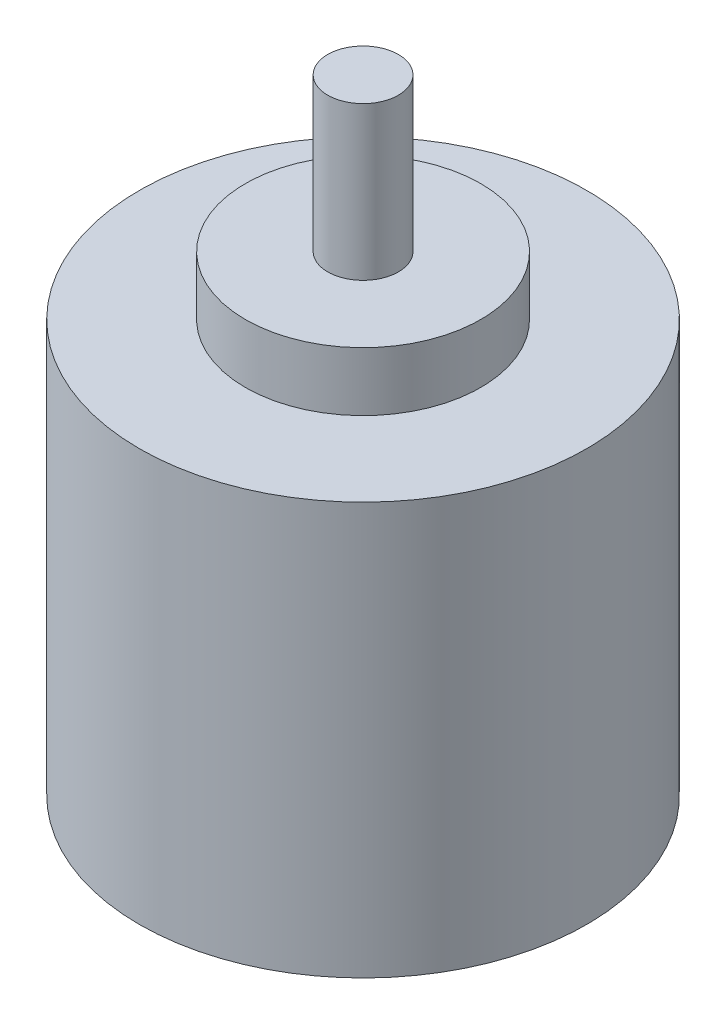
ISO-10303-21;
HEADER;
FILE_DESCRIPTION(('STEP AP214'),'2;1');
FILE_NAME('part.step','',(''),(''),'','','');
FILE_SCHEMA(('AUTOMOTIVE_DESIGN { 1 0 10303 214 1 1 1 1 }'));
ENDSEC;
DATA;
#1=APPLICATION_CONTEXT('core data for automotive mechanical design processes');
#2=APPLICATION_PROTOCOL_DEFINITION('international standard','automotive_design',2000,#1);
#3=PRODUCT_CONTEXT('',#1,'mechanical');
#4=PRODUCT('Part','Part','',(#3));
#5=PRODUCT_RELATED_PRODUCT_CATEGORY('part','',(#4));
#6=PRODUCT_DEFINITION_FORMATION('','',#4);
#7=PRODUCT_DEFINITION_CONTEXT('part definition',#1,'design');
#8=PRODUCT_DEFINITION('design','',#6,#7);
#9=PRODUCT_DEFINITION_SHAPE('','',#8);
#10=(LENGTH_UNIT() NAMED_UNIT(*) SI_UNIT(.MILLI.,.METRE.));
#11=(NAMED_UNIT(*) PLANE_ANGLE_UNIT() SI_UNIT($,.RADIAN.));
#12=(NAMED_UNIT(*) SI_UNIT($,.STERADIAN.) SOLID_ANGLE_UNIT());
#13=UNCERTAINTY_MEASURE_WITH_UNIT(LENGTH_MEASURE(1.E-05),#10,'distance_accuracy_value','');
#14=(GEOMETRIC_REPRESENTATION_CONTEXT(3) GLOBAL_UNCERTAINTY_ASSIGNED_CONTEXT((#13)) GLOBAL_UNIT_ASSIGNED_CONTEXT((#10,
#11,#12)) REPRESENTATION_CONTEXT('',''));
#15=CARTESIAN_POINT('',(0.,0.,0.));
#16=DIRECTION('',(0.,0.,1.));
#17=DIRECTION('',(1.,0.,0.));
#18=AXIS2_PLACEMENT_3D('',#15,#16,#17);
#19=CARTESIAN_POINT('',(0.,35.,0.));
#20=DIRECTION('',(0.,-1.,0.));
#21=DIRECTION('',(0.,0.,-1.));
#22=AXIS2_PLACEMENT_3D('',#19,#20,#21);
#23=CYLINDRICAL_SURFACE('',#22,19.);
#24=CARTESIAN_POINT('',(0.,35.,0.));
#25=DIRECTION('',(0.,1.,0.));
#26=DIRECTION('',(0.,0.,1.));
#27=AXIS2_PLACEMENT_3D('',#24,#25,#26);
#28=CIRCLE('',#27,19.);
#29=CARTESIAN_POINT('',(0.,35.,19.));
#30=VERTEX_POINT('',#29);
#31=EDGE_CURVE('E51',#30,#30,#28,.T.);
#32=ORIENTED_EDGE('',*,*,#31,.F.);
#33=EDGE_LOOP('',(#32));
#34=FACE_BOUND('',#33,.T.);
#35=CARTESIAN_POINT('',(0.,0.,0.));
#36=DIRECTION('',(0.,1.,0.));
#37=DIRECTION('',(0.,0.,1.));
#38=AXIS2_PLACEMENT_3D('',#35,#36,#37);
#39=CIRCLE('',#38,19.);
#40=CARTESIAN_POINT('',(0.,0.,19.));
#41=VERTEX_POINT('',#40);
#42=EDGE_CURVE('E40',#41,#41,#39,.T.);
#43=ORIENTED_EDGE('',*,*,#42,.T.);
#44=EDGE_LOOP('',(#43));
#45=FACE_BOUND('',#44,.T.);
#46=ADVANCED_FACE('F37',(#34,#45),#23,.T.);
#47=CARTESIAN_POINT('',(0.,35.,0.));
#48=DIRECTION('',(0.,1.,0.));
#49=DIRECTION('',(0.,0.,1.));
#50=AXIS2_PLACEMENT_3D('',#47,#48,#49);
#51=PLANE('',#50);
#52=CARTESIAN_POINT('',(0.,35.,0.));
#53=DIRECTION('',(0.,1.,0.));
#54=DIRECTION('',(0.,0.,1.));
#55=AXIS2_PLACEMENT_3D('',#52,#53,#54);
#56=CIRCLE('',#55,10.);
#57=CARTESIAN_POINT('',(0.,35.,10.));
#58=VERTEX_POINT('',#57);
#59=EDGE_CURVE('E45',#58,#58,#56,.T.);
#60=ORIENTED_EDGE('',*,*,#59,.F.);
#61=EDGE_LOOP('',(#60));
#62=FACE_BOUND('',#61,.T.);
#63=ORIENTED_EDGE('',*,*,#31,.T.);
#64=EDGE_LOOP('',(#63));
#65=FACE_BOUND('',#64,.T.);
#66=ADVANCED_FACE('F71',(#62,#65),#51,.T.);
#67=CARTESIAN_POINT('',(0.,0.,0.));
#68=DIRECTION('',(0.,1.,0.));
#69=DIRECTION('',(0.,0.,1.));
#70=AXIS2_PLACEMENT_3D('',#67,#68,#69);
#71=PLANE('',#70);
#72=ORIENTED_EDGE('',*,*,#42,.F.);
#73=EDGE_LOOP('',(#72));
#74=FACE_BOUND('',#73,.T.);
#75=ADVANCED_FACE('F68',(#74),#71,.F.);
#76=CARTESIAN_POINT('',(0.,40.,0.));
#77=DIRECTION('',(0.,-1.,0.));
#78=DIRECTION('',(0.,0.,-1.));
#79=AXIS2_PLACEMENT_3D('',#76,#77,#78);
#80=CYLINDRICAL_SURFACE('',#79,10.);
#81=CARTESIAN_POINT('',(0.,40.,0.));
#82=DIRECTION('',(0.,1.,0.));
#83=DIRECTION('',(0.,0.,1.));
#84=AXIS2_PLACEMENT_3D('',#81,#82,#83);
#85=CIRCLE('',#84,10.);
#86=CARTESIAN_POINT('',(0.,40.,10.));
#87=VERTEX_POINT('',#86);
#88=EDGE_CURVE('E56',#87,#87,#85,.T.);
#89=ORIENTED_EDGE('',*,*,#88,.F.);
#90=EDGE_LOOP('',(#89));
#91=FACE_BOUND('',#90,.T.);
#92=ORIENTED_EDGE('',*,*,#59,.T.);
#93=EDGE_LOOP('',(#92));
#94=FACE_BOUND('',#93,.T.);
#95=ADVANCED_FACE('F70',(#91,#94),#80,.T.);
#96=CARTESIAN_POINT('',(0.,40.,0.));
#97=DIRECTION('',(0.,1.,0.));
#98=DIRECTION('',(0.,0.,1.));
#99=AXIS2_PLACEMENT_3D('',#96,#97,#98);
#100=PLANE('',#99);
#101=CARTESIAN_POINT('',(0.,40.,0.));
#102=DIRECTION('',(0.,1.,0.));
#103=DIRECTION('',(0.,0.,1.));
#104=AXIS2_PLACEMENT_3D('',#101,#102,#103);
#105=CIRCLE('',#104,3.);
#106=CARTESIAN_POINT('',(0.,40.,-3.));
#107=VERTEX_POINT('',#106);
#108=EDGE_CURVE('E10',#107,#107,#105,.T.);
#109=ORIENTED_EDGE('',*,*,#108,.F.);
#110=EDGE_LOOP('',(#109));
#111=FACE_BOUND('',#110,.T.);
#112=ORIENTED_EDGE('',*,*,#88,.T.);
#113=EDGE_LOOP('',(#112));
#114=FACE_BOUND('',#113,.T.);
#115=ADVANCED_FACE('F76',(#111,#114),#100,.T.);
#116=CARTESIAN_POINT('',(0.,53.,0.));
#117=DIRECTION('',(0.,-1.,0.));
#118=DIRECTION('',(0.,0.,-1.));
#119=AXIS2_PLACEMENT_3D('',#116,#117,#118);
#120=CYLINDRICAL_SURFACE('',#119,3.);
#121=CARTESIAN_POINT('',(0.,53.,0.));
#122=DIRECTION('',(0.,1.,0.));
#123=DIRECTION('',(0.,0.,1.));
#124=AXIS2_PLACEMENT_3D('',#121,#122,#123);
#125=CIRCLE('',#124,3.);
#126=CARTESIAN_POINT('',(0.,53.,-3.));
#127=VERTEX_POINT('',#126);
#128=EDGE_CURVE('E55',#127,#127,#125,.T.);
#129=CARTESIAN_POINT('',(0.,53.,-3.));
#130=CARTESIAN_POINT('',(0.,52.8645833333333,-3.));
#131=CARTESIAN_POINT('',(0.,52.7291666666667,-3.));
#132=CARTESIAN_POINT('',(0.,52.4583333333333,-3.));
#133=CARTESIAN_POINT('',(0.,52.3229166666667,-3.));
#134=CARTESIAN_POINT('',(0.,52.0520833333333,-3.));
#135=CARTESIAN_POINT('',(0.,51.9166666666667,-3.));
#136=CARTESIAN_POINT('',(0.,51.6458333333333,-3.));
#137=CARTESIAN_POINT('',(0.,51.5104166666667,-3.));
#138=CARTESIAN_POINT('',(0.,51.2395833333333,-3.));
#139=CARTESIAN_POINT('',(0.,51.1041666666667,-3.));
#140=CARTESIAN_POINT('',(0.,50.8333333333333,-3.));
#141=CARTESIAN_POINT('',(0.,50.6979166666667,-3.));
#142=CARTESIAN_POINT('',(0.,50.4270833333333,-3.));
#143=CARTESIAN_POINT('',(0.,50.2916666666667,-3.));
#144=CARTESIAN_POINT('',(0.,50.0208333333333,-3.));
#145=CARTESIAN_POINT('',(0.,49.8854166666667,-3.));
#146=CARTESIAN_POINT('',(0.,49.6145833333333,-3.));
#147=CARTESIAN_POINT('',(0.,49.4791666666667,-3.));
#148=CARTESIAN_POINT('',(0.,49.2083333333333,-3.));
#149=CARTESIAN_POINT('',(0.,49.0729166666667,-3.));
#150=CARTESIAN_POINT('',(0.,48.8020833333333,-3.));
#151=CARTESIAN_POINT('',(0.,48.6666666666667,-3.));
#152=CARTESIAN_POINT('',(0.,48.3958333333333,-3.));
#153=CARTESIAN_POINT('',(0.,48.2604166666667,-3.));
#154=CARTESIAN_POINT('',(0.,47.9895833333333,-3.));
#155=CARTESIAN_POINT('',(0.,47.8541666666667,-3.));
#156=CARTESIAN_POINT('',(0.,47.5833333333333,-3.));
#157=CARTESIAN_POINT('',(0.,47.4479166666667,-3.));
#158=CARTESIAN_POINT('',(0.,47.1770833333333,-3.));
#159=CARTESIAN_POINT('',(0.,47.0416666666667,-3.));
#160=CARTESIAN_POINT('',(0.,46.7708333333333,-3.));
#161=CARTESIAN_POINT('',(0.,46.6354166666667,-3.));
#162=CARTESIAN_POINT('',(0.,46.3645833333333,-3.));
#163=CARTESIAN_POINT('',(0.,46.2291666666667,-3.));
#164=CARTESIAN_POINT('',(0.,45.9583333333333,-3.));
#165=CARTESIAN_POINT('',(0.,45.8229166666667,-3.));
#166=CARTESIAN_POINT('',(0.,45.5520833333333,-3.));
#167=CARTESIAN_POINT('',(0.,45.4166666666667,-3.));
#168=CARTESIAN_POINT('',(0.,45.1458333333333,-3.));
#169=CARTESIAN_POINT('',(0.,45.0104166666667,-3.));
#170=CARTESIAN_POINT('',(0.,44.7395833333333,-3.));
#171=CARTESIAN_POINT('',(0.,44.6041666666667,-3.));
#172=CARTESIAN_POINT('',(0.,44.3333333333333,-3.));
#173=CARTESIAN_POINT('',(0.,44.1979166666667,-3.));
#174=CARTESIAN_POINT('',(0.,43.9270833333333,-3.));
#175=CARTESIAN_POINT('',(0.,43.7916666666667,-3.));
#176=CARTESIAN_POINT('',(0.,43.5208333333333,-3.));
#177=CARTESIAN_POINT('',(0.,43.3854166666667,-3.));
#178=CARTESIAN_POINT('',(0.,43.1145833333333,-3.));
#179=CARTESIAN_POINT('',(0.,42.9791666666667,-3.));
#180=CARTESIAN_POINT('',(0.,42.7083333333333,-3.));
#181=CARTESIAN_POINT('',(0.,42.5729166666667,-3.));
#182=CARTESIAN_POINT('',(0.,42.3020833333333,-3.));
#183=CARTESIAN_POINT('',(0.,42.1666666666667,-3.));
#184=CARTESIAN_POINT('',(0.,41.8958333333333,-3.));
#185=CARTESIAN_POINT('',(0.,41.7604166666667,-3.));
#186=CARTESIAN_POINT('',(0.,41.4895833333333,-3.));
#187=CARTESIAN_POINT('',(0.,41.3541666666667,-3.));
#188=CARTESIAN_POINT('',(0.,41.0833333333333,-3.));
#189=CARTESIAN_POINT('',(0.,40.9479166666667,-3.));
#190=CARTESIAN_POINT('',(0.,40.6770833333333,-3.));
#191=CARTESIAN_POINT('',(0.,40.5416666666667,-3.));
#192=CARTESIAN_POINT('',(0.,40.2708333333333,-3.));
#193=CARTESIAN_POINT('',(0.,40.1354166666667,-3.));
#194=CARTESIAN_POINT('',(0.,40.,-3.));
#195=B_SPLINE_CURVE_WITH_KNOTS('',3,(#129,#130,#131,#132,#133,#134,#135,#136,#137,#138,#139,
#140,#141,#142,#143,#144,#145,#146,#147,#148,#149,#150,#151,#152,#153,#154,#155,#156,#157,#158,
#159,#160,#161,#162,#163,#164,#165,#166,#167,#168,#169,#170,#171,#172,#173,#174,#175,#176,#177,
#178,#179,#180,#181,#182,#183,#184,#185,#186,#187,#188,#189,#190,#191,#192,#193,#194),
.UNSPECIFIED.,.F.,.F.,(4,2,2,2,2,2,2,2,2,2,2,2,2,2,2,2,2,2,2,2,2,2,2,2,2,2,2,2,2,2,2,2,4),(0.,
0.406250000000004,0.812500000000001,1.21875,1.625,2.03125000000001,2.4375,2.84375,3.25,3.65625,
4.0625,4.46875,4.875,5.28125,5.68750000000001,6.09375,6.5,6.90625,7.3125,7.71875,8.125,8.53125,
8.9375,9.34375,9.75,10.15625,10.5625,10.96875,11.375,11.78125,12.1875,12.59375,13.),.UNSPECIFIED.);
#196=EDGE_CURVE('BSEAM106',#127,#107,#195,.T.);
#197=ORIENTED_EDGE('',*,*,#128,.F.);
#198=ORIENTED_EDGE('',*,*,#108,.T.);
#199=ORIENTED_EDGE('',*,*,#196,.T.);
#200=ORIENTED_EDGE('',*,*,#196,.F.);
#201=EDGE_LOOP('',(#197,#199,#198,#200));
#202=FACE_BOUND('',#201,.T.);
#203=ADVANCED_FACE('F106',(#202),#120,.T.);
#204=CARTESIAN_POINT('',(0.,53.,0.));
#205=DIRECTION('',(0.,1.,0.));
#206=DIRECTION('',(0.,0.,1.));
#207=AXIS2_PLACEMENT_3D('',#204,#205,#206);
#208=PLANE('',#207);
#209=ORIENTED_EDGE('',*,*,#128,.T.);
#210=EDGE_LOOP('',(#209));
#211=FACE_BOUND('',#210,.T.);
#212=ADVANCED_FACE('F116',(#211),#208,.T.);
#213=CLOSED_SHELL('',(#46,#66,#75,#95,#115,#203,#212));
#214=MANIFOLD_SOLID_BREP('B2',#213);
#215=ADVANCED_BREP_SHAPE_REPRESENTATION('',(#18,#214),#14);
#216=SHAPE_DEFINITION_REPRESENTATION(#9,#215);
ENDSEC;
END-ISO-10303-21;
